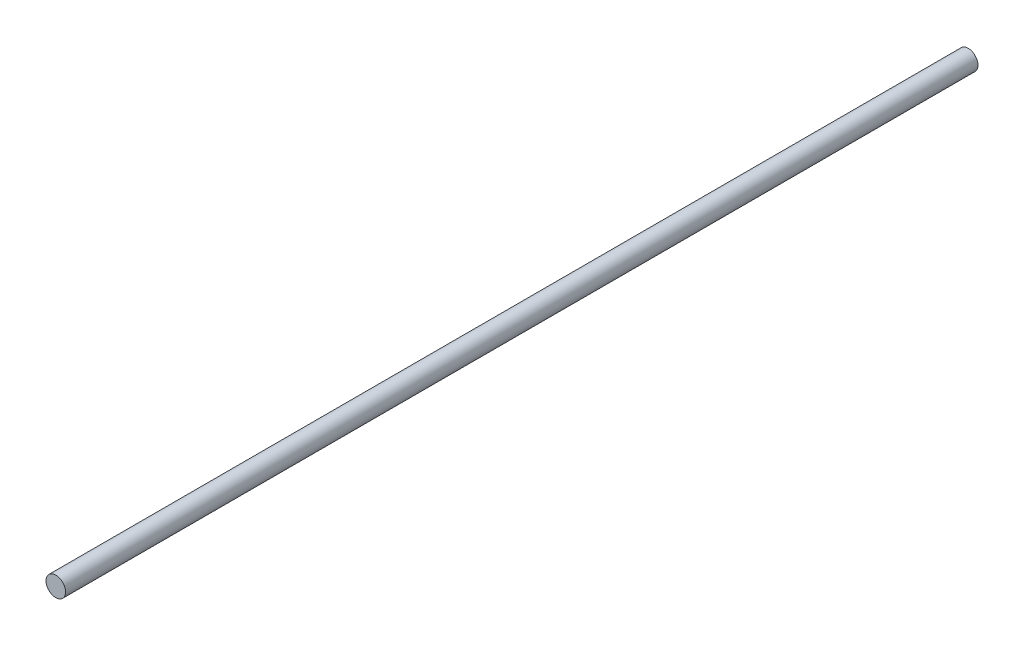
ISO-10303-21;
HEADER;
FILE_DESCRIPTION(('STEP AP214'),'2;1');
FILE_NAME('part.step','',(''),(''),'','','');
FILE_SCHEMA(('AUTOMOTIVE_DESIGN { 1 0 10303 214 1 1 1 1 }'));
ENDSEC;
DATA;
#1=APPLICATION_CONTEXT('core data for automotive mechanical design processes');
#2=APPLICATION_PROTOCOL_DEFINITION('international standard','automotive_design',2000,#1);
#3=PRODUCT_CONTEXT('',#1,'mechanical');
#4=PRODUCT('Part','Part','',(#3));
#5=PRODUCT_RELATED_PRODUCT_CATEGORY('part','',(#4));
#6=PRODUCT_DEFINITION_FORMATION('','',#4);
#7=PRODUCT_DEFINITION_CONTEXT('part definition',#1,'design');
#8=PRODUCT_DEFINITION('design','',#6,#7);
#9=PRODUCT_DEFINITION_SHAPE('','',#8);
#10=(LENGTH_UNIT() NAMED_UNIT(*) SI_UNIT(.MILLI.,.METRE.));
#11=(NAMED_UNIT(*) PLANE_ANGLE_UNIT() SI_UNIT($,.RADIAN.));
#12=(NAMED_UNIT(*) SI_UNIT($,.STERADIAN.) SOLID_ANGLE_UNIT());
#13=UNCERTAINTY_MEASURE_WITH_UNIT(LENGTH_MEASURE(1.E-05),#10,'distance_accuracy_value','');
#14=(GEOMETRIC_REPRESENTATION_CONTEXT(3) GLOBAL_UNCERTAINTY_ASSIGNED_CONTEXT((#13)) GLOBAL_UNIT_ASSIGNED_CONTEXT((#10,
#11,#12)) REPRESENTATION_CONTEXT('',''));
#15=CARTESIAN_POINT('',(0.,0.,0.));
#16=DIRECTION('',(0.,0.,1.));
#17=DIRECTION('',(1.,0.,0.));
#18=AXIS2_PLACEMENT_3D('',#15,#16,#17);
#19=CARTESIAN_POINT('',(0.,0.,280.));
#20=DIRECTION('',(0.,0.,-1.));
#21=DIRECTION('',(-1.,0.,0.));
#22=AXIS2_PLACEMENT_3D('',#19,#20,#21);
#23=CYLINDRICAL_SURFACE('',#22,3.);
#24=CARTESIAN_POINT('',(0.,0.,280.));
#25=DIRECTION('',(0.,0.,1.));
#26=DIRECTION('',(1.,0.,0.));
#27=AXIS2_PLACEMENT_3D('',#24,#25,#26);
#28=CIRCLE('',#27,3.);
#29=CARTESIAN_POINT('',(3.,0.,280.));
#30=VERTEX_POINT('',#29);
#31=EDGE_CURVE('E10',#30,#30,#28,.T.);
#32=ORIENTED_EDGE('',*,*,#31,.F.);
#33=EDGE_LOOP('',(#32));
#34=FACE_BOUND('',#33,.T.);
#35=CARTESIAN_POINT('',(0.,0.,0.));
#36=DIRECTION('',(0.,0.,1.));
#37=DIRECTION('',(1.,0.,0.));
#38=AXIS2_PLACEMENT_3D('',#35,#36,#37);
#39=CIRCLE('',#38,3.);
#40=CARTESIAN_POINT('',(3.,0.,0.));
#41=VERTEX_POINT('',#40);
#42=EDGE_CURVE('E34',#41,#41,#39,.T.);
#43=ORIENTED_EDGE('',*,*,#42,.T.);
#44=EDGE_LOOP('',(#43));
#45=FACE_BOUND('',#44,.T.);
#46=ADVANCED_FACE('F31',(#34,#45),#23,.T.);
#47=CARTESIAN_POINT('',(0.,0.,280.));
#48=DIRECTION('',(0.,0.,1.));
#49=DIRECTION('',(1.,0.,0.));
#50=AXIS2_PLACEMENT_3D('',#47,#48,#49);
#51=PLANE('',#50);
#52=ORIENTED_EDGE('',*,*,#31,.T.);
#53=EDGE_LOOP('',(#52));
#54=FACE_BOUND('',#53,.T.);
#55=ADVANCED_FACE('F46',(#54),#51,.T.);
#56=CARTESIAN_POINT('',(0.,0.,0.));
#57=DIRECTION('',(0.,0.,1.));
#58=DIRECTION('',(1.,0.,0.));
#59=AXIS2_PLACEMENT_3D('',#56,#57,#58);
#60=PLANE('',#59);
#61=ORIENTED_EDGE('',*,*,#42,.F.);
#62=EDGE_LOOP('',(#61));
#63=FACE_BOUND('',#62,.T.);
#64=ADVANCED_FACE('F44',(#63),#60,.F.);
#65=CLOSED_SHELL('',(#46,#55,#64));
#66=MANIFOLD_SOLID_BREP('B2',#65);
#67=ADVANCED_BREP_SHAPE_REPRESENTATION('',(#18,#66),#14);
#68=SHAPE_DEFINITION_REPRESENTATION(#9,#67);
ENDSEC;
END-ISO-10303-21;
